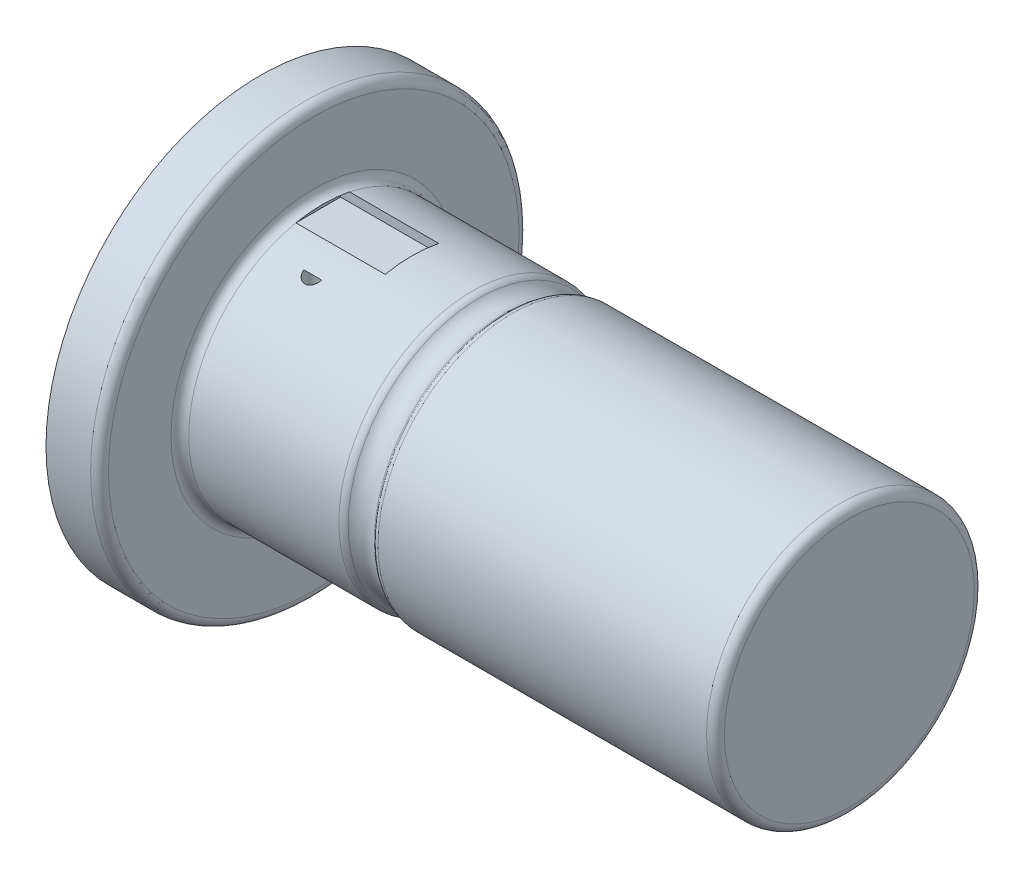
ISO-10303-21;
HEADER;
FILE_DESCRIPTION(('STEP AP214'),'2;1');
FILE_NAME('part.step','',(''),(''),'','','');
FILE_SCHEMA(('AUTOMOTIVE_DESIGN { 1 0 10303 214 1 1 1 1 }'));
ENDSEC;
DATA;
#1=APPLICATION_CONTEXT('core data for automotive mechanical design processes');
#2=APPLICATION_PROTOCOL_DEFINITION('international standard','automotive_design',2000,#1);
#3=PRODUCT_CONTEXT('',#1,'mechanical');
#4=PRODUCT('Part','Part','',(#3));
#5=PRODUCT_RELATED_PRODUCT_CATEGORY('part','',(#4));
#6=PRODUCT_DEFINITION_FORMATION('','',#4);
#7=PRODUCT_DEFINITION_CONTEXT('part definition',#1,'design');
#8=PRODUCT_DEFINITION('design','',#6,#7);
#9=PRODUCT_DEFINITION_SHAPE('','',#8);
#10=(LENGTH_UNIT() NAMED_UNIT(*) SI_UNIT(.MILLI.,.METRE.));
#11=(NAMED_UNIT(*) PLANE_ANGLE_UNIT() SI_UNIT($,.RADIAN.));
#12=(NAMED_UNIT(*) SI_UNIT($,.STERADIAN.) SOLID_ANGLE_UNIT());
#13=UNCERTAINTY_MEASURE_WITH_UNIT(LENGTH_MEASURE(1.E-05),#10,'distance_accuracy_value','');
#14=(GEOMETRIC_REPRESENTATION_CONTEXT(3) GLOBAL_UNCERTAINTY_ASSIGNED_CONTEXT((#13)) GLOBAL_UNIT_ASSIGNED_CONTEXT((#10,
#11,#12)) REPRESENTATION_CONTEXT('',''));
#15=CARTESIAN_POINT('',(0.,0.,0.));
#16=DIRECTION('',(0.,0.,1.));
#17=DIRECTION('',(1.,0.,0.));
#18=AXIS2_PLACEMENT_3D('',#15,#16,#17);
#19=CARTESIAN_POINT('',(13.7332121111929,0.,-7.34));
#20=CARTESIAN_POINT('',(13.7332121111929,-1.92160746857583,-7.33999999999999));
#21=CARTESIAN_POINT('',(13.7332121111923,-3.83138210210588,-6.54894544571172));
#22=CARTESIAN_POINT('',(13.7332121111935,-6.54894544571267,-3.83138210210675));
#23=CARTESIAN_POINT('',(13.7332121111929,-7.34,-1.92160746857666));
#24=CARTESIAN_POINT('',(13.7332121111929,-7.34,1.92160746857672));
#25=CARTESIAN_POINT('',(13.7332121111937,-6.54894544572052,3.8313821020992));
#26=CARTESIAN_POINT('',(13.7332121111922,-3.83138210209795,6.54894544571936));
#27=CARTESIAN_POINT('',(13.7332121111929,-1.92160746857146,7.34));
#28=CARTESIAN_POINT('',(13.7332121111929,1.92160746857152,7.34));
#29=CARTESIAN_POINT('',(13.7332121111926,3.83138210210221,6.54894544571586));
#30=CARTESIAN_POINT('',(13.7332121111932,6.54894544571635,3.83138210210262));
#31=CARTESIAN_POINT('',(13.7332121111929,7.34,1.92160746857346));
#32=CARTESIAN_POINT('',(13.7332121111929,7.34,-1.92160746857352));
#33=CARTESIAN_POINT('',(13.7332121111929,6.54894544571644,-3.83138210210209));
#34=CARTESIAN_POINT('',(13.7332121111929,3.83138210210204,-6.54894544571647));
#35=CARTESIAN_POINT('',(13.7332121111929,1.92160746857577,-7.34));
#36=CARTESIAN_POINT('',(13.7332121111929,0.,-7.34));
#37=CARTESIAN_POINT('',(13.8816002765534,0.,-7.5));
#38=CARTESIAN_POINT('',(13.8816002765534,-1.96349536979797,-7.5));
#39=CARTESIAN_POINT('',(13.8816002765551,-3.91489996809341,-6.69170174970395));
#40=CARTESIAN_POINT('',(13.8816002765517,-6.69170174970485,-3.91489996809422));
#41=CARTESIAN_POINT('',(13.8816002765534,-7.5,-1.96349536979904));
#42=CARTESIAN_POINT('',(13.8816002765534,-7.5,1.9634953697991));
#43=CARTESIAN_POINT('',(13.8816002765534,-6.69170174971599,3.91489996808138));
#44=CARTESIAN_POINT('',(13.8816002765534,-3.91489996808218,6.69170174971688));
#45=CARTESIAN_POINT('',(13.8816002765551,-1.96349536979339,7.49999999999915));
#46=CARTESIAN_POINT('',(13.8816002765517,1.96349536979345,7.50000000000085));
#47=CARTESIAN_POINT('',(13.8816002765534,3.91489996808819,6.69170174971003));
#48=CARTESIAN_POINT('',(13.8816002765534,6.69170174971007,3.91489996808814));
#49=CARTESIAN_POINT('',(13.8816002765534,7.5,1.96349536979577));
#50=CARTESIAN_POINT('',(13.8816002765534,7.5,-1.96349536979583));
#51=CARTESIAN_POINT('',(13.8816002765534,6.69170174971076,-3.9148999680883));
#52=CARTESIAN_POINT('',(13.8816002765534,3.91489996808741,-6.69170174970996));
#53=CARTESIAN_POINT('',(13.8816002765534,1.9634953697979,-7.5));
#54=CARTESIAN_POINT('',(13.8816002765534,0.,-7.5));
#55=CARTESIAN_POINT('',(14.0998181667894,0.,-7.5));
#56=CARTESIAN_POINT('',(14.0998181667894,-1.96349536979782,-7.49999999999999));
#57=CARTESIAN_POINT('',(14.0998181667894,-3.91489996809426,-6.69170174970396));
#58=CARTESIAN_POINT('',(14.0998181667894,-6.69170174970399,-3.91489996809421));
#59=CARTESIAN_POINT('',(14.0998181667894,-7.50000000000001,-1.96349536979904));
#60=CARTESIAN_POINT('',(14.0998181667894,-7.49999999999999,1.96349536979909));
#61=CARTESIAN_POINT('',(14.0998181667894,-6.6917017497177,3.91489996808053));
#62=CARTESIAN_POINT('',(14.0998181667894,-3.91489996808047,6.69170174971773));
#63=CARTESIAN_POINT('',(14.0998181667894,-1.96349536979316,7.50000000000001));
#64=CARTESIAN_POINT('',(14.0998181667894,1.96349536979323,7.49999999999999));
#65=CARTESIAN_POINT('',(14.0998181667894,3.91489996808819,6.69170174971003));
#66=CARTESIAN_POINT('',(14.0998181667894,6.69170174971006,3.91489996808814));
#67=CARTESIAN_POINT('',(14.0998181667894,7.50000000000001,1.96349536979577));
#68=CARTESIAN_POINT('',(14.0998181667894,7.49999999999999,-1.96349536979583));
#69=CARTESIAN_POINT('',(14.0998181667894,6.69170174971077,-3.91489996808745));
#70=CARTESIAN_POINT('',(14.0998181667894,3.9148999680874,-6.6917017497108));
#71=CARTESIAN_POINT('',(14.0998181667894,1.96349536979775,-7.50000000000001));
#72=CARTESIAN_POINT('',(14.0998181667894,0.,-7.5));
#73=(BOUNDED_SURFACE() B_SPLINE_SURFACE(2,3,((#19,#20,#21,#22,#23,#24,#25,#26,#27,#28,#29,#30,
#31,#32,#33,#34,#35,#36),(#37,#38,#39,#40,#41,#42,#43,#44,#45,#46,#47,#48,#49,#50,#51,#52,#53,
#54),(#55,#56,#57,#58,#59,#60,#61,#62,#63,#64,#65,#66,#67,#68,#69,#70,#71,#72)),.UNSPECIFIED.,
.F.,.T.,.F.) B_SPLINE_SURFACE_WITH_KNOTS((3,3),(4,2,2,2,2,2,2,2,4),(0.,1.),(-0.499999999999999,
-0.374999999999999,-0.249999999999999,-0.124999999999999,0.,0.125000000000001,0.250000000000001,
0.375000000000001,0.500000000000001),
.UNSPECIFIED.) GEOMETRIC_REPRESENTATION_ITEM() RATIONAL_B_SPLINE_SURFACE(((1.,1.,1.,1.,1.,1.,1.,
1.,1.,1.,1.,1.,1.,1.,1.,1.,1.,1.),(0.916515138991168,0.916515138991168,0.916515138991168,
0.916515138991168,0.916515138991168,0.916515138991168,0.916515138991168,0.916515138991168,
0.916515138991168,0.916515138991168,0.916515138991168,0.916515138991168,0.916515138991168,
0.916515138991168,0.916515138991167,0.916515138991167,0.916515138991168,0.916515138991168),(1.,
1.,1.,1.,1.,1.,1.,1.,1.,1.,1.,1.,1.,1.,1.,1.,1.,1.))) REPRESENTATION_ITEM('') SURFACE());
#74=CARTESIAN_POINT('',(13.7332121111929,0.,-7.34));
#75=CARTESIAN_POINT('',(13.7332121111929,1.92160746857577,-7.34));
#76=CARTESIAN_POINT('',(13.7332121111929,3.83138210210204,-6.54894544571647));
#77=CARTESIAN_POINT('',(13.7332121111929,6.54894544571644,-3.83138210210209));
#78=CARTESIAN_POINT('',(13.7332121111929,7.34,-1.92160746857352));
#79=CARTESIAN_POINT('',(13.7332121111929,7.34,1.92160746857346));
#80=CARTESIAN_POINT('',(13.7332121111932,6.54894544571635,3.83138210210262));
#81=CARTESIAN_POINT('',(13.7332121111926,3.83138210210221,6.54894544571586));
#82=CARTESIAN_POINT('',(13.7332121111929,1.92160746857152,7.34));
#83=CARTESIAN_POINT('',(13.7332121111929,-1.92160746857146,7.34));
#84=CARTESIAN_POINT('',(13.7332121111922,-3.83138210209795,6.54894544571936));
#85=CARTESIAN_POINT('',(13.7332121111937,-6.54894544572052,3.8313821020992));
#86=CARTESIAN_POINT('',(13.7332121111929,-7.34,1.92160746857672));
#87=CARTESIAN_POINT('',(13.7332121111929,-7.34,-1.92160746857666));
#88=CARTESIAN_POINT('',(13.7332121111935,-6.54894544571267,-3.83138210210675));
#89=CARTESIAN_POINT('',(13.7332121111923,-3.83138210210588,-6.54894544571172));
#90=CARTESIAN_POINT('',(13.7332121111929,-1.92160746857583,-7.33999999999999));
#91=CARTESIAN_POINT('',(13.7332121111929,0.,-7.34));
#92=(BOUNDED_CURVE() B_SPLINE_CURVE(3,(#74,#75,#76,#77,#78,#79,#80,#81,#82,#83,#84,#85,#86,#87,
#88,#89,#90,#91),.UNSPECIFIED.,.T.,.F.) B_SPLINE_CURVE_WITH_KNOTS((4,2,2,2,2,2,2,2,4),
(-0.499999999999999,-0.374999999999999,-0.249999999999999,-0.124999999999999,0.,
0.125000000000001,0.250000000000001,0.375000000000001,0.500000000000001),
.UNSPECIFIED.) CURVE() GEOMETRIC_REPRESENTATION_ITEM() RATIONAL_B_SPLINE_CURVE((1.,1.,1.,1.,1.,
1.,1.,1.,1.,1.,1.,1.,1.,1.,1.,1.,1.,1.)) REPRESENTATION_ITEM(''));
#93=CARTESIAN_POINT('',(13.7332121111929,0.,-7.34));
#94=VERTEX_POINT('',#93);
#95=EDGE_CURVE('E61',#94,#94,#92,.F.);
#96=CARTESIAN_POINT('',(14.0998181667894,0.,-7.5));
#97=CARTESIAN_POINT('',(14.0998181667894,-1.96349536979782,-7.49999999999999));
#98=CARTESIAN_POINT('',(14.0998181667894,-3.91489996809426,-6.69170174970396));
#99=CARTESIAN_POINT('',(14.0998181667894,-6.69170174970399,-3.91489996809421));
#100=CARTESIAN_POINT('',(14.0998181667894,-7.50000000000001,-1.96349536979904));
#101=CARTESIAN_POINT('',(14.0998181667894,-7.49999999999999,1.96349536979909));
#102=CARTESIAN_POINT('',(14.0998181667894,-6.6917017497177,3.91489996808053));
#103=CARTESIAN_POINT('',(14.0998181667894,-3.91489996808047,6.69170174971773));
#104=CARTESIAN_POINT('',(14.0998181667894,-1.96349536979316,7.50000000000001));
#105=CARTESIAN_POINT('',(14.0998181667894,1.96349536979323,7.49999999999999));
#106=CARTESIAN_POINT('',(14.0998181667894,3.91489996808819,6.69170174971003));
#107=CARTESIAN_POINT('',(14.0998181667894,6.69170174971006,3.91489996808814));
#108=CARTESIAN_POINT('',(14.0998181667894,7.50000000000001,1.96349536979577));
#109=CARTESIAN_POINT('',(14.0998181667894,7.49999999999999,-1.96349536979583));
#110=CARTESIAN_POINT('',(14.0998181667894,6.69170174971077,-3.91489996808745));
#111=CARTESIAN_POINT('',(14.0998181667894,3.9148999680874,-6.6917017497108));
#112=CARTESIAN_POINT('',(14.0998181667894,1.96349536979775,-7.50000000000001));
#113=CARTESIAN_POINT('',(14.0998181667894,0.,-7.5));
#114=(BOUNDED_CURVE() B_SPLINE_CURVE(3,(#96,#97,#98,#99,#100,#101,#102,#103,#104,#105,#106,#107,
#108,#109,#110,#111,#112,#113),.UNSPECIFIED.,.T.,.F.) B_SPLINE_CURVE_WITH_KNOTS((4,2,2,2,2,2,2,
2,4),(-0.499999999999999,-0.374999999999999,-0.249999999999999,-0.124999999999999,0.,
0.125000000000001,0.250000000000001,0.375000000000001,0.500000000000001),
.UNSPECIFIED.) CURVE() GEOMETRIC_REPRESENTATION_ITEM() RATIONAL_B_SPLINE_CURVE((1.,1.,1.,1.,1.,
1.,1.,1.,1.,1.,1.,1.,1.,1.,1.,1.,1.,1.)) REPRESENTATION_ITEM(''));
#115=CARTESIAN_POINT('',(14.0998181667894,0.,-7.5));
#116=VERTEX_POINT('',#115);
#117=EDGE_CURVE('E12',#116,#116,#114,.F.);
#118=ORIENTED_EDGE('',*,*,#95,.F.);
#119=EDGE_LOOP('',(#118));
#120=FACE_BOUND('',#119,.T.);
#121=ORIENTED_EDGE('',*,*,#117,.F.);
#122=EDGE_LOOP('',(#121));
#123=FACE_BOUND('',#122,.T.);
#124=ADVANCED_FACE('F48',(#120,#123),#73,.T.);
#125=CARTESIAN_POINT('',(11.9001818332106,0.,0.));
#126=DIRECTION('',(-1.,0.,0.));
#127=DIRECTION('',(0.,0.,1.));
#128=AXIS2_PLACEMENT_3D('',#125,#126,#127);
#129=TOROIDAL_SURFACE('',#128,7.,0.5);
#130=CARTESIAN_POINT('',(12.2667878888071,0.,0.));
#131=DIRECTION('',(1.,0.,0.));
#132=DIRECTION('',(0.,0.,-1.));
#133=AXIS2_PLACEMENT_3D('',#130,#131,#132);
#134=CIRCLE('',#133,7.34000000000002);
#135=CARTESIAN_POINT('',(12.2667878888071,0.,-7.34000000000002));
#136=VERTEX_POINT('',#135);
#137=EDGE_CURVE('E148',#136,#136,#134,.T.);
#138=ORIENTED_EDGE('',*,*,#137,.F.);
#139=EDGE_LOOP('',(#138));
#140=FACE_BOUND('',#139,.T.);
#141=CARTESIAN_POINT('',(11.9001818332106,0.,0.));
#142=DIRECTION('',(-1.,0.,0.));
#143=DIRECTION('',(0.,0.,1.));
#144=AXIS2_PLACEMENT_3D('',#141,#142,#143);
#145=CIRCLE('',#144,7.5);
#146=CARTESIAN_POINT('',(11.9001818332106,0.,7.5));
#147=VERTEX_POINT('',#146);
#148=EDGE_CURVE('E151',#147,#147,#145,.T.);
#149=ORIENTED_EDGE('',*,*,#148,.F.);
#150=EDGE_LOOP('',(#149));
#151=FACE_BOUND('',#150,.T.);
#152=ADVANCED_FACE('F236',(#140,#151),#129,.T.);
#153=CARTESIAN_POINT('',(33.,0.,0.));
#154=DIRECTION('',(-1.,0.,0.));
#155=DIRECTION('',(0.,0.,1.));
#156=AXIS2_PLACEMENT_3D('',#153,#154,#155);
#157=CYLINDRICAL_SURFACE('',#156,7.5);
#158=ORIENTED_EDGE('',*,*,#148,.T.);
#159=EDGE_LOOP('',(#158));
#160=FACE_BOUND('',#159,.T.);
#161=CARTESIAN_POINT('',(6.,-6.6332495807108,3.5));
#162=CARTESIAN_POINT('',(6.02581046020677,-6.63325053725622,3.49999846839941));
#163=CARTESIAN_POINT('',(6.05164287902081,-6.63431112340443,3.4979904336543));
#164=CARTESIAN_POINT('',(6.10254548667345,-6.63849100686603,3.49005103934906));
#165=CARTESIAN_POINT('',(6.12761457211608,-6.64161314891078,3.48411425850542));
#166=CARTESIAN_POINT('',(6.17619277650404,-6.64971850111664,3.46861923085948));
#167=CARTESIAN_POINT('',(6.19970656829205,-6.65469580760864,3.45907247066952));
#168=CARTESIAN_POINT('',(6.24470549105987,-6.66625131636745,3.43675001256464));
#169=CARTESIAN_POINT('',(6.26619068485855,-6.67282946903885,3.42397441468104));
#170=CARTESIAN_POINT('',(6.30775972750533,-6.68766176311949,3.3949165950777));
#171=CARTESIAN_POINT('',(6.32771786794,-6.6959838078913,3.37848977809819));
#172=CARTESIAN_POINT('',(6.36463360975647,-6.71373750142494,3.34307063646503));
#173=CARTESIAN_POINT('',(6.38159003689068,-6.72316958203291,3.32407731291411));
#174=CARTESIAN_POINT('',(6.41394637517371,-6.74389888572919,3.28183462201197));
#175=CARTESIAN_POINT('',(6.42897703930128,-6.75528741377898,3.25834704920194));
#176=CARTESIAN_POINT('',(6.45486217382584,-6.77865813001283,3.20944376515965));
#177=CARTESIAN_POINT('',(6.46571473980553,-6.79064058611288,3.18402718096928));
#178=CARTESIAN_POINT('',(6.48384088811419,-6.81591531939925,3.12958053647244));
#179=CARTESIAN_POINT('',(6.49071897684761,-6.82923057388007,3.10042877781246));
#180=CARTESIAN_POINT('',(6.49918423983507,-6.85576008605139,3.04131614019466));
#181=CARTESIAN_POINT('',(6.50077011148669,-6.86897431807827,3.01135506386414));
#182=CARTESIAN_POINT('',(6.49850525344405,-6.89530590415973,2.95057337948523));
#183=CARTESIAN_POINT('',(6.49449932162345,-6.90840992177046,2.91975245375204));
#184=CARTESIAN_POINT('',(6.48072911560121,-6.93375291528264,2.85904742101141));
#185=CARTESIAN_POINT('',(6.47096560145005,-6.94599200512323,2.82916319090036));
#186=CARTESIAN_POINT('',(6.44622578744554,-6.9688425944184,2.77238830870901));
#187=CARTESIAN_POINT('',(6.43144674654557,-6.97949643624613,2.7454290608923));
#188=CARTESIAN_POINT('',(6.39688585061558,-6.99937958260056,2.69433428415712));
#189=CARTESIAN_POINT('',(6.37710620669908,-7.00860951384002,2.67019751410621));
#190=CARTESIAN_POINT('',(6.33458993675361,-7.02479345982809,2.62731166124381));
#191=CARTESIAN_POINT('',(6.31215845250471,-7.0318617732696,2.60830327951922));
#192=CARTESIAN_POINT('',(6.26399864013113,-7.04436018919063,2.57435774208213));
#193=CARTESIAN_POINT('',(6.23827179283219,-7.04979102384412,2.55941876708508));
#194=CARTESIAN_POINT('',(6.18615372870463,-7.05856516952076,2.53511616939487));
#195=CARTESIAN_POINT('',(6.15992633634759,-7.06202521828376,2.52544276770339));
#196=CARTESIAN_POINT('',(6.10607404514197,-7.0673212382192,2.51058430869189));
#197=CARTESIAN_POINT('',(6.07844955711137,-7.06915768391261,2.50539793998248));
#198=CARTESIAN_POINT('',(6.02386615638336,-7.0711216406553,2.49984937188802));
#199=CARTESIAN_POINT('',(5.99692967122139,-7.07131921272316,2.49928940067872));
#200=CARTESIAN_POINT('',(5.9433500470587,-7.07018524500487,2.50249544816273));
#201=CARTESIAN_POINT('',(5.91670687534621,-7.06885387751405,2.50626097941763));
#202=CARTESIAN_POINT('',(5.864777650389,-7.06471436568139,2.51790549214181));
#203=CARTESIAN_POINT('',(5.83947963861141,-7.0619231291992,2.52573737071171));
#204=CARTESIAN_POINT('',(5.79060062092451,-7.05493222848629,2.54519891477317));
#205=CARTESIAN_POINT('',(5.76701969406707,-7.05073249946064,2.55682875498184));
#206=CARTESIAN_POINT('',(5.72172596030691,-7.04091524343145,2.58374163497954));
#207=CARTESIAN_POINT('',(5.70005869955032,-7.0352715983626,2.59909166329152));
#208=CARTESIAN_POINT('',(5.65962455931582,-7.02272744983348,2.63279736088945));
#209=CARTESIAN_POINT('',(5.64085819244333,-7.01582672470784,2.65115356020638));
#210=CARTESIAN_POINT('',(5.60580047546282,-7.00055984391923,2.69121561626974));
#211=CARTESIAN_POINT('',(5.58966550726509,-6.99214032738236,2.71303781934433));
#212=CARTESIAN_POINT('',(5.56126661447413,-6.97425940431029,2.75867841368377));
#213=CARTESIAN_POINT('',(5.54900374566106,-6.96479771455943,2.78249734714761));
#214=CARTESIAN_POINT('',(5.52783569685234,-6.94438081287179,2.83308414835651));
#215=CARTESIAN_POINT('',(5.51920323911089,-6.93336835890187,2.85994297577407));
#216=CARTESIAN_POINT('',(5.50658066021234,-6.91063756134362,2.91444011515551));
#217=CARTESIAN_POINT('',(5.50259208351752,-6.89891898427487,2.94207868331728));
#218=CARTESIAN_POINT('',(5.49912493457228,-6.87423716925231,2.99931623301412));
#219=CARTESIAN_POINT('',(5.49996864297422,-6.86124328827825,3.02892172552297));
#220=CARTESIAN_POINT('',(5.50682710922799,-6.83510082939237,3.08746264852342));
#221=CARTESIAN_POINT('',(5.51284346863132,-6.82195220481271,3.11639786863614));
#222=CARTESIAN_POINT('',(5.5302511225581,-6.79534713728128,3.17400435780609));
#223=CARTESIAN_POINT('',(5.54185038645721,-6.78189981840915,3.20261739427579));
#224=CARTESIAN_POINT('',(5.57028428645139,-6.7557168015545,3.25748602989674));
#225=CARTESIAN_POINT('',(5.58711933858784,-6.74298116021755,3.28374144149484));
#226=CARTESIAN_POINT('',(5.6253303857361,-6.71901075752431,3.33250930118534));
#227=CARTESIAN_POINT('',(5.64660569310222,-6.70775048251857,3.3550877126302));
#228=CARTESIAN_POINT('',(5.69347702022071,-6.68700340630464,3.39625054413835));
#229=CARTESIAN_POINT('',(5.71907147933598,-6.67751596711857,3.41483640133546));
#230=CARTESIAN_POINT('',(5.77139173763239,-6.66168110152889,3.44561722697866));
#231=CARTESIAN_POINT('',(5.79780296521047,-6.65512657957989,3.45823968625457));
#232=CARTESIAN_POINT('',(5.85282541833604,-6.64443166346298,3.47874456934257));
#233=CARTESIAN_POINT('',(5.88143084623722,-6.64028513966552,3.48663903003222));
#234=CARTESIAN_POINT('',(5.92530189465387,-6.63608827362723,3.49461589666869));
#235=CARTESIAN_POINT('',(5.94014689590899,-6.63502633627207,3.49663091841857));
#236=CARTESIAN_POINT('',(5.96999212580487,-6.63360671975203,3.49932340010726));
#237=CARTESIAN_POINT('',(5.98499235089675,-6.63324902452165,3.50000089055847));
#238=CARTESIAN_POINT('',(6.,-6.6332495807108,3.5));
#239=B_SPLINE_CURVE_WITH_KNOTS('',3,(#161,#162,#163,#164,#165,#166,#167,#168,#169,#170,#171,
#172,#173,#174,#175,#176,#177,#178,#179,#180,#181,#182,#183,#184,#185,#186,#187,#188,#189,#190,
#191,#192,#193,#194,#195,#196,#197,#198,#199,#200,#201,#202,#203,#204,#205,#206,#207,#208,#209,
#210,#211,#212,#213,#214,#215,#216,#217,#218,#219,#220,#221,#222,#223,#224,#225,#226,#227,#228,
#229,#230,#231,#232,#233,#234,#235,#236,#237,#238),.UNSPECIFIED.,.T.,.F.,(4,2,2,2,2,2,2,2,2,2,2,
2,2,2,2,2,2,2,2,2,2,2,2,2,2,2,2,2,2,2,2,2,2,2,2,2,2,2,4),(0.,0.0773721108397583,
0.154851210838869,0.232085826323507,0.309318049326463,0.390453696729441,0.471621013982055,
0.561606601903227,0.651633157695472,0.749524586330706,0.847440107743616,0.948127988502521,
1.04880258056817,1.14590491918395,1.24296439698378,1.3332088309533,1.42341285343893,
1.50748980026067,1.59154216627396,1.67198177530605,1.75241232053338,1.83193131698797,
1.91145397205949,1.9925316288286,2.07362359617045,2.15850008845585,2.24339970351781,
2.33386337053339,2.42435711537505,2.52095349472301,2.61757979292877,2.71812247785703,
2.81867315405753,2.91715248441261,3.0155963071701,3.10508732168977,3.19434952422925,
3.23933903509871,3.28432751963401),.UNSPECIFIED.);
#240=CARTESIAN_POINT('',(6.,-6.6332495807108,3.5));
#241=VERTEX_POINT('',#240);
#242=EDGE_CURVE('E143',#241,#241,#239,.T.);
#243=ORIENTED_EDGE('',*,*,#242,.T.);
#244=EDGE_LOOP('',(#243));
#245=FACE_BOUND('',#244,.T.);
#246=DIRECTION('',(-1.,0.,0.));
#247=VECTOR('',#246,1.);
#248=CARTESIAN_POINT('',(33.,6.84846922834953,3.0575266521078));
#249=LINE('',#248,#247);
#250=CARTESIAN_POINT('',(5.50332034036286,6.84846922834953,3.0575266521078));
#251=VERTEX_POINT('',#250);
#252=CARTESIAN_POINT('',(6.49667965963714,6.84846922834953,3.0575266521078));
#253=VERTEX_POINT('',#252);
#254=EDGE_CURVE('E134',#251,#253,#249,.F.);
#255=ORIENTED_EDGE('',*,*,#254,.T.);
#256=CARTESIAN_POINT('',(6.49667965963714,6.84846922834953,3.0575266521078));
#257=CARTESIAN_POINT('',(6.49319790975419,6.83502318788622,3.0876634787824));
#258=CARTESIAN_POINT('',(6.48696040762637,6.82147999795609,3.11744517069168));
#259=CARTESIAN_POINT('',(6.46914708738009,6.794611504604,3.17557096142006));
#260=CARTESIAN_POINT('',(6.4575573758415,6.78128686228145,3.20391110437284));
#261=CARTESIAN_POINT('',(6.42921572297062,6.75532668742682,3.25829390853775));
#262=CARTESIAN_POINT('',(6.41245749308836,6.74269201654868,3.28433372100822));
#263=CARTESIAN_POINT('',(6.37408700932944,6.71866932036597,3.33319988003086));
#264=CARTESIAN_POINT('',(6.35247937370277,6.7072801242022,3.35602925056633));
#265=CARTESIAN_POINT('',(6.30608445763364,6.68687476209494,3.39649739560704));
#266=CARTESIAN_POINT('',(6.28151999034378,6.67776620471821,3.414343853599));
#267=CARTESIAN_POINT('',(6.22902315975787,6.66174010836067,3.44550828212296));
#268=CARTESIAN_POINT('',(6.20109338339999,6.65482090106056,3.45882970137787));
#269=CARTESIAN_POINT('',(6.1460515249407,6.64430256138163,3.478988164914));
#270=CARTESIAN_POINT('',(6.1191987644345,6.64041819556818,3.48638471041787));
#271=CARTESIAN_POINT('',(6.06441129861515,6.63503745574211,3.4966144488506));
#272=CARTESIAN_POINT('',(6.0364774219722,6.63353928844844,3.49945106867951));
#273=CARTESIAN_POINT('',(5.98312119300806,6.63305948989809,3.50036014589193));
#274=CARTESIAN_POINT('',(5.95770677283871,6.63385685866327,3.49885098458424));
#275=CARTESIAN_POINT('',(5.90754272158415,6.63745064997678,3.49202857484656));
#276=CARTESIAN_POINT('',(5.8827930293029,6.64024688784662,3.4867156778493));
#277=CARTESIAN_POINT('',(5.83489267723412,6.64763621336476,3.47260632317404));
#278=CARTESIAN_POINT('',(5.8117277860656,6.65220983206384,3.46384759774542));
#279=CARTESIAN_POINT('',(5.7672356135016,6.66292246282814,3.44319605131114));
#280=CARTESIAN_POINT('',(5.74590874897638,6.66906182876624,3.43130252179133));
#281=CARTESIAN_POINT('',(5.70408718451563,6.68311172650462,3.40386114244076));
#282=CARTESIAN_POINT('',(5.68375315897483,6.69111565729944,3.38811685842738));
#283=CARTESIAN_POINT('',(5.64598200363001,6.70827951819017,3.35400513178917));
#284=CARTESIAN_POINT('',(5.62854622475008,6.71743998388667,3.33563647327328));
#285=CARTESIAN_POINT('',(5.59511368682763,6.7376283019787,3.29468347217933));
#286=CARTESIAN_POINT('',(5.5794693422165,6.74875110738242,3.27185842034959));
#287=CARTESIAN_POINT('',(5.55224235741386,6.77164850709554,3.22420148277242));
#288=CARTESIAN_POINT('',(5.54066028784538,6.78342319270503,3.19936931569019));
#289=CARTESIAN_POINT('',(5.52422335103637,6.80412575576511,3.1550440296851));
#290=CARTESIAN_POINT('',(5.51839981157616,6.81298501031867,3.13587102488243));
#291=CARTESIAN_POINT('',(5.50909894402987,6.8307309950273,3.09702665970978));
#292=CARTESIAN_POINT('',(5.50561678132765,6.8396176302664,3.07735641381474));
#293=CARTESIAN_POINT('',(5.50332034036286,6.84846922834953,3.0575266521078));
#294=B_SPLINE_CURVE_WITH_KNOTS('',3,(#256,#257,#258,#259,#260,#261,#262,#263,#264,#265,#266,
#267,#268,#269,#270,#271,#272,#273,#274,#275,#276,#277,#278,#279,#280,#281,#282,#283,#284,#285,
#286,#287,#288,#289,#290,#291,#292,#293),.UNSPECIFIED.,.F.,.F.,(4,2,2,2,2,2,2,2,2,2,2,2,2,2,2,2,
2,2,4),(0.,0.0994489086693399,0.19915743345689,0.298987755681097,0.398723406587445,
0.493290374977345,0.587785107326142,0.671686839579734,0.755525488020934,0.831570147569043,
0.907607782145605,0.982834987488655,1.05807920994392,1.13854943405235,1.21905706221166,
1.30816057276007,1.39727659456628,1.46287837383179,1.52834427515067),.UNSPECIFIED.);
#295=EDGE_CURVE('E138',#253,#251,#294,.T.);
#296=ORIENTED_EDGE('',*,*,#295,.T.);
#297=EDGE_LOOP('',(#255,#296));
#298=FACE_BOUND('',#297,.T.);
#299=DIRECTION('',(-1.,0.,0.));
#300=VECTOR('',#299,1.);
#301=CARTESIAN_POINT('',(8.5,7.34846922834953,-1.5));
#302=LINE('',#301,#300);
#303=CARTESIAN_POINT('',(8.5,7.34846922834953,-1.5));
#304=VERTEX_POINT('',#303);
#305=CARTESIAN_POINT('',(3.5,7.34846922834953,-1.5));
#306=VERTEX_POINT('',#305);
#307=EDGE_CURVE('E324',#304,#306,#302,.T.);
#308=ORIENTED_EDGE('',*,*,#307,.F.);
#309=CARTESIAN_POINT('',(8.5,0.,0.));
#310=DIRECTION('',(1.,0.,0.));
#311=DIRECTION('',(0.,0.,-1.));
#312=AXIS2_PLACEMENT_3D('',#309,#310,#311);
#313=CIRCLE('',#312,7.5);
#314=CARTESIAN_POINT('',(8.5,7.34846922834953,1.5));
#315=VERTEX_POINT('',#314);
#316=EDGE_CURVE('E296',#304,#315,#313,.T.);
#317=ORIENTED_EDGE('',*,*,#316,.T.);
#318=DIRECTION('',(-1.,0.,0.));
#319=VECTOR('',#318,1.);
#320=CARTESIAN_POINT('',(8.5,7.34846922834953,1.5));
#321=LINE('',#320,#319);
#322=CARTESIAN_POINT('',(3.5,7.34846922834953,1.5));
#323=VERTEX_POINT('',#322);
#324=EDGE_CURVE('E320',#315,#323,#321,.T.);
#325=ORIENTED_EDGE('',*,*,#324,.T.);
#326=CARTESIAN_POINT('',(3.5,0.,0.));
#327=DIRECTION('',(-1.,0.,0.));
#328=DIRECTION('',(0.,0.,1.));
#329=AXIS2_PLACEMENT_3D('',#326,#327,#328);
#330=CIRCLE('',#329,7.5);
#331=CARTESIAN_POINT('',(3.5,-7.34846922834953,1.5));
#332=VERTEX_POINT('',#331);
#333=EDGE_CURVE('E370',#323,#332,#330,.F.);
#334=ORIENTED_EDGE('',*,*,#333,.T.);
#335=DIRECTION('',(-1.,0.,0.));
#336=VECTOR('',#335,1.);
#337=CARTESIAN_POINT('',(8.5,-7.34846922834953,1.5));
#338=LINE('',#337,#336);
#339=CARTESIAN_POINT('',(8.5,-7.34846922834953,1.5));
#340=VERTEX_POINT('',#339);
#341=EDGE_CURVE('E308',#340,#332,#338,.T.);
#342=ORIENTED_EDGE('',*,*,#341,.F.);
#343=CARTESIAN_POINT('',(8.5,0.,0.));
#344=DIRECTION('',(1.,0.,0.));
#345=DIRECTION('',(0.,0.,-1.));
#346=AXIS2_PLACEMENT_3D('',#343,#344,#345);
#347=CIRCLE('',#346,7.5);
#348=CARTESIAN_POINT('',(8.5,-7.34846922834953,-1.5));
#349=VERTEX_POINT('',#348);
#350=EDGE_CURVE('E331',#340,#349,#347,.T.);
#351=ORIENTED_EDGE('',*,*,#350,.T.);
#352=DIRECTION('',(-1.,0.,0.));
#353=VECTOR('',#352,1.);
#354=CARTESIAN_POINT('',(8.5,-7.34846922834953,-1.5));
#355=LINE('',#354,#353);
#356=CARTESIAN_POINT('',(3.5,-7.34846922834953,-1.5));
#357=VERTEX_POINT('',#356);
#358=EDGE_CURVE('E356',#349,#357,#355,.T.);
#359=ORIENTED_EDGE('',*,*,#358,.T.);
#360=EDGE_CURVE('E374',#357,#306,#330,.F.);
#361=ORIENTED_EDGE('',*,*,#360,.T.);
#362=EDGE_LOOP('',(#308,#317,#325,#334,#342,#351,#359,#361));
#363=FACE_BOUND('',#362,.T.);
#364=ADVANCED_FACE('F146',(#160,#245,#298,#363),#157,.T.);
#365=CARTESIAN_POINT('',(3.5,0.,0.));
#366=DIRECTION('',(-1.,0.,0.));
#367=DIRECTION('',(0.,0.,1.));
#368=AXIS2_PLACEMENT_3D('',#365,#366,#367);
#369=TOROIDAL_SURFACE('',#368,8.,0.5);
#370=EDGE_CURVE('E371',#332,#357,#330,.F.);
#371=ORIENTED_EDGE('',*,*,#370,.F.);
#372=ORIENTED_EDGE('',*,*,#333,.F.);
#373=EDGE_CURVE('E665',#306,#323,#330,.F.);
#374=ORIENTED_EDGE('',*,*,#373,.F.);
#375=ORIENTED_EDGE('',*,*,#360,.F.);
#376=EDGE_LOOP('',(#371,#372,#374,#375));
#377=FACE_BOUND('',#376,.T.);
#378=CARTESIAN_POINT('',(3.,0.,0.));
#379=DIRECTION('',(-1.,0.,0.));
#380=DIRECTION('',(0.,0.,1.));
#381=AXIS2_PLACEMENT_3D('',#378,#379,#380);
#382=CIRCLE('',#381,8.);
#383=CARTESIAN_POINT('',(3.,0.,8.));
#384=VERTEX_POINT('',#383);
#385=EDGE_CURVE('E373',#384,#384,#382,.T.);
#386=ORIENTED_EDGE('',*,*,#385,.F.);
#387=EDGE_LOOP('',(#386));
#388=FACE_BOUND('',#387,.T.);
#389=ADVANCED_FACE('F387',(#377,#388),#369,.F.);
#390=CARTESIAN_POINT('',(3.,0.,0.));
#391=DIRECTION('',(-1.,0.,0.));
#392=DIRECTION('',(0.,0.,1.));
#393=AXIS2_PLACEMENT_3D('',#390,#391,#392);
#394=PLANE('',#393);
#395=ORIENTED_EDGE('',*,*,#385,.T.);
#396=EDGE_LOOP('',(#395));
#397=FACE_BOUND('',#396,.T.);
#398=CARTESIAN_POINT('',(3.,0.,0.));
#399=DIRECTION('',(1.,0.,0.));
#400=DIRECTION('',(0.,0.,-1.));
#401=AXIS2_PLACEMENT_3D('',#398,#399,#400);
#402=CIRCLE('',#401,11.5);
#403=CARTESIAN_POINT('',(3.,0.,-11.5));
#404=VERTEX_POINT('',#403);
#405=EDGE_CURVE('E367',#404,#404,#402,.T.);
#406=ORIENTED_EDGE('',*,*,#405,.T.);
#407=EDGE_LOOP('',(#406));
#408=FACE_BOUND('',#407,.T.);
#409=ADVANCED_FACE('F392',(#397,#408),#394,.F.);
#410=CARTESIAN_POINT('',(2.5,0.,0.));
#411=DIRECTION('',(1.,0.,0.));
#412=DIRECTION('',(0.,0.,-1.));
#413=AXIS2_PLACEMENT_3D('',#410,#411,#412);
#414=TOROIDAL_SURFACE('',#413,11.5,0.499999999999999);
#415=CARTESIAN_POINT('',(2.5,0.,0.));
#416=DIRECTION('',(1.,0.,0.));
#417=DIRECTION('',(0.,0.,-1.));
#418=AXIS2_PLACEMENT_3D('',#415,#416,#417);
#419=CIRCLE('',#418,12.);
#420=CARTESIAN_POINT('',(2.5,0.,-12.));
#421=VERTEX_POINT('',#420);
#422=EDGE_CURVE('E364',#421,#421,#419,.T.);
#423=ORIENTED_EDGE('',*,*,#422,.T.);
#424=EDGE_LOOP('',(#423));
#425=FACE_BOUND('',#424,.T.);
#426=ORIENTED_EDGE('',*,*,#405,.F.);
#427=EDGE_LOOP('',(#426));
#428=FACE_BOUND('',#427,.T.);
#429=ADVANCED_FACE('F406',(#425,#428),#414,.T.);
#430=CARTESIAN_POINT('',(3.,0.,0.));
#431=DIRECTION('',(1.,0.,0.));
#432=DIRECTION('',(0.,0.,-1.));
#433=AXIS2_PLACEMENT_3D('',#430,#431,#432);
#434=CYLINDRICAL_SURFACE('',#433,12.);
#435=ORIENTED_EDGE('',*,*,#422,.F.);
#436=EDGE_LOOP('',(#435));
#437=FACE_BOUND('',#436,.T.);
#438=CARTESIAN_POINT('',(0.,0.,0.));
#439=DIRECTION('',(1.,0.,0.));
#440=DIRECTION('',(0.,0.,-1.));
#441=AXIS2_PLACEMENT_3D('',#438,#439,#440);
#442=CIRCLE('',#441,12.);
#443=CARTESIAN_POINT('',(0.,0.,-12.));
#444=VERTEX_POINT('',#443);
#445=EDGE_CURVE('E327',#444,#444,#442,.T.);
#446=ORIENTED_EDGE('',*,*,#445,.T.);
#447=EDGE_LOOP('',(#446));
#448=FACE_BOUND('',#447,.T.);
#449=ADVANCED_FACE('F414',(#437,#448),#434,.T.);
#450=CARTESIAN_POINT('',(0.,0.,0.));
#451=DIRECTION('',(1.,0.,0.));
#452=DIRECTION('',(0.,0.,-1.));
#453=AXIS2_PLACEMENT_3D('',#450,#451,#452);
#454=PLANE('',#453);
#455=CARTESIAN_POINT('',(0.,0.,0.));
#456=DIRECTION('',(-1.,0.,0.));
#457=DIRECTION('',(0.,0.,1.));
#458=AXIS2_PLACEMENT_3D('',#455,#456,#457);
#459=CIRCLE('',#458,5.);
#460=CARTESIAN_POINT('',(0.,0.,5.));
#461=VERTEX_POINT('',#460);
#462=EDGE_CURVE('E288',#461,#461,#459,.T.);
#463=ORIENTED_EDGE('',*,*,#462,.F.);
#464=EDGE_LOOP('',(#463));
#465=FACE_BOUND('',#464,.T.);
#466=ORIENTED_EDGE('',*,*,#445,.F.);
#467=EDGE_LOOP('',(#466));
#468=FACE_BOUND('',#467,.T.);
#469=ADVANCED_FACE('F219',(#465,#468),#454,.F.);
#470=CARTESIAN_POINT('',(8.5,0.,1.5));
#471=DIRECTION('',(0.,0.,1.));
#472=DIRECTION('',(1.,0.,0.));
#473=AXIS2_PLACEMENT_3D('',#470,#471,#472);
#474=PLANE('',#473);
#475=DIRECTION('',(0.,1.,0.));
#476=VECTOR('',#475,1.);
#477=CARTESIAN_POINT('',(3.,0.,1.5));
#478=LINE('',#477,#476);
#479=CARTESIAN_POINT('',(3.,-7.34846922834953,1.5));
#480=VERTEX_POINT('',#479);
#481=CARTESIAN_POINT('',(3.,-6.84846922834953,1.5));
#482=VERTEX_POINT('',#481);
#483=EDGE_CURVE('E341',#480,#482,#478,.T.);
#484=ORIENTED_EDGE('',*,*,#483,.T.);
#485=DIRECTION('',(-1.,0.,0.));
#486=VECTOR('',#485,1.);
#487=CARTESIAN_POINT('',(8.5,-6.84846922834953,1.5));
#488=LINE('',#487,#486);
#489=CARTESIAN_POINT('',(8.5,-6.84846922834953,1.5));
#490=VERTEX_POINT('',#489);
#491=EDGE_CURVE('E340',#490,#482,#488,.T.);
#492=ORIENTED_EDGE('',*,*,#491,.F.);
#493=DIRECTION('',(0.,1.,0.));
#494=VECTOR('',#493,1.);
#495=CARTESIAN_POINT('',(8.5,0.,1.5));
#496=LINE('',#495,#494);
#497=EDGE_CURVE('E328',#340,#490,#496,.T.);
#498=ORIENTED_EDGE('',*,*,#497,.F.);
#499=ORIENTED_EDGE('',*,*,#341,.T.);
#500=EDGE_CURVE('E359',#332,#480,#338,.T.);
#501=ORIENTED_EDGE('',*,*,#500,.T.);
#502=EDGE_LOOP('',(#484,#492,#498,#499,#501));
#503=FACE_BOUND('',#502,.T.);
#504=ADVANCED_FACE('F216',(#503),#474,.F.);
#505=CARTESIAN_POINT('',(8.5,0.,0.));
#506=DIRECTION('',(-1.,0.,0.));
#507=DIRECTION('',(0.,0.,1.));
#508=AXIS2_PLACEMENT_3D('',#505,#506,#507);
#509=CYLINDRICAL_SURFACE('',#508,7.5);
#510=CARTESIAN_POINT('',(3.,-7.34846922834953,-1.5));
#511=VERTEX_POINT('',#510);
#512=EDGE_CURVE('E355',#357,#511,#355,.T.);
#513=ORIENTED_EDGE('',*,*,#512,.T.);
#514=CARTESIAN_POINT('',(3.,0.,0.));
#515=DIRECTION('',(1.,0.,0.));
#516=DIRECTION('',(0.,0.,-1.));
#517=AXIS2_PLACEMENT_3D('',#514,#515,#516);
#518=CIRCLE('',#517,7.5);
#519=EDGE_CURVE('E344',#480,#511,#518,.T.);
#520=ORIENTED_EDGE('',*,*,#519,.F.);
#521=ORIENTED_EDGE('',*,*,#500,.F.);
#522=ORIENTED_EDGE('',*,*,#370,.T.);
#523=EDGE_LOOP('',(#513,#520,#521,#522));
#524=FACE_BOUND('',#523,.T.);
#525=ADVANCED_FACE('F212',(#524),#509,.F.);
#526=CARTESIAN_POINT('',(8.5,0.,-1.5));
#527=DIRECTION('',(0.,0.,-1.));
#528=DIRECTION('',(-1.,0.,0.));
#529=AXIS2_PLACEMENT_3D('',#526,#527,#528);
#530=PLANE('',#529);
#531=DIRECTION('',(0.,-1.,0.));
#532=VECTOR('',#531,1.);
#533=CARTESIAN_POINT('',(3.,0.,-1.5));
#534=LINE('',#533,#532);
#535=CARTESIAN_POINT('',(3.,-6.84846922834953,-1.5));
#536=VERTEX_POINT('',#535);
#537=EDGE_CURVE('E347',#536,#511,#534,.T.);
#538=ORIENTED_EDGE('',*,*,#537,.T.);
#539=ORIENTED_EDGE('',*,*,#512,.F.);
#540=ORIENTED_EDGE('',*,*,#358,.F.);
#541=DIRECTION('',(0.,-1.,0.));
#542=VECTOR('',#541,1.);
#543=CARTESIAN_POINT('',(8.5,0.,-1.5));
#544=LINE('',#543,#542);
#545=CARTESIAN_POINT('',(8.5,-6.84846922834953,-1.5));
#546=VERTEX_POINT('',#545);
#547=EDGE_CURVE('E335',#546,#349,#544,.T.);
#548=ORIENTED_EDGE('',*,*,#547,.F.);
#549=DIRECTION('',(-1.,0.,0.));
#550=VECTOR('',#549,1.);
#551=CARTESIAN_POINT('',(8.5,-6.84846922834953,-1.5));
#552=LINE('',#551,#550);
#553=EDGE_CURVE('E353',#546,#536,#552,.T.);
#554=ORIENTED_EDGE('',*,*,#553,.T.);
#555=EDGE_LOOP('',(#538,#539,#540,#548,#554));
#556=FACE_BOUND('',#555,.T.);
#557=ADVANCED_FACE('F208',(#556),#530,.F.);
#558=CARTESIAN_POINT('',(8.5,-6.84846922834953,0.));
#559=DIRECTION('',(0.,1.,0.));
#560=DIRECTION('',(0.,0.,1.));
#561=AXIS2_PLACEMENT_3D('',#558,#559,#560);
#562=PLANE('',#561);
#563=DIRECTION('',(0.,0.,-1.));
#564=VECTOR('',#563,1.);
#565=CARTESIAN_POINT('',(3.,-6.84846922834953,0.));
#566=LINE('',#565,#564);
#567=EDGE_CURVE('E332',#482,#536,#566,.T.);
#568=ORIENTED_EDGE('',*,*,#567,.T.);
#569=ORIENTED_EDGE('',*,*,#553,.F.);
#570=DIRECTION('',(0.,0.,-1.));
#571=VECTOR('',#570,1.);
#572=CARTESIAN_POINT('',(8.5,-6.84846922834953,0.));
#573=LINE('',#572,#571);
#574=EDGE_CURVE('E337',#490,#546,#573,.T.);
#575=ORIENTED_EDGE('',*,*,#574,.F.);
#576=ORIENTED_EDGE('',*,*,#491,.T.);
#577=EDGE_LOOP('',(#568,#569,#575,#576));
#578=FACE_BOUND('',#577,.T.);
#579=ADVANCED_FACE('F201',(#578),#562,.F.);
#580=CARTESIAN_POINT('',(8.5,0.,0.));
#581=DIRECTION('',(1.,0.,0.));
#582=DIRECTION('',(0.,0.,-1.));
#583=AXIS2_PLACEMENT_3D('',#580,#581,#582);
#584=PLANE('',#583);
#585=ORIENTED_EDGE('',*,*,#497,.T.);
#586=ORIENTED_EDGE('',*,*,#574,.T.);
#587=ORIENTED_EDGE('',*,*,#547,.T.);
#588=ORIENTED_EDGE('',*,*,#350,.F.);
#589=EDGE_LOOP('',(#585,#586,#587,#588));
#590=FACE_BOUND('',#589,.T.);
#591=ADVANCED_FACE('F198',(#590),#584,.F.);
#592=CARTESIAN_POINT('',(3.,0.,0.));
#593=DIRECTION('',(1.,0.,0.));
#594=DIRECTION('',(0.,0.,-1.));
#595=AXIS2_PLACEMENT_3D('',#592,#593,#594);
#596=PLANE('',#595);
#597=ORIENTED_EDGE('',*,*,#483,.F.);
#598=ORIENTED_EDGE('',*,*,#519,.T.);
#599=ORIENTED_EDGE('',*,*,#537,.F.);
#600=ORIENTED_EDGE('',*,*,#567,.F.);
#601=EDGE_LOOP('',(#597,#598,#599,#600));
#602=FACE_BOUND('',#601,.T.);
#603=ADVANCED_FACE('F196',(#602),#596,.T.);
#604=CARTESIAN_POINT('',(8.5,0.,-1.5));
#605=DIRECTION('',(0.,0.,1.));
#606=DIRECTION('',(1.,0.,0.));
#607=AXIS2_PLACEMENT_3D('',#604,#605,#606);
#608=PLANE('',#607);
#609=DIRECTION('',(0.,1.,0.));
#610=VECTOR('',#609,1.);
#611=CARTESIAN_POINT('',(3.,0.,-1.5));
#612=LINE('',#611,#610);
#613=CARTESIAN_POINT('',(3.,6.84846922834953,-1.5));
#614=VERTEX_POINT('',#613);
#615=CARTESIAN_POINT('',(3.,7.34846922834953,-1.5));
#616=VERTEX_POINT('',#615);
#617=EDGE_CURVE('E304',#614,#616,#612,.T.);
#618=ORIENTED_EDGE('',*,*,#617,.F.);
#619=DIRECTION('',(-1.,0.,0.));
#620=VECTOR('',#619,1.);
#621=CARTESIAN_POINT('',(8.5,6.84846922834953,-1.5));
#622=LINE('',#621,#620);
#623=CARTESIAN_POINT('',(8.5,6.84846922834953,-1.5));
#624=VERTEX_POINT('',#623);
#625=EDGE_CURVE('E303',#624,#614,#622,.T.);
#626=ORIENTED_EDGE('',*,*,#625,.F.);
#627=DIRECTION('',(0.,1.,0.));
#628=VECTOR('',#627,1.);
#629=CARTESIAN_POINT('',(8.5,0.,-1.5));
#630=LINE('',#629,#628);
#631=EDGE_CURVE('E293',#624,#304,#630,.T.);
#632=ORIENTED_EDGE('',*,*,#631,.T.);
#633=ORIENTED_EDGE('',*,*,#307,.T.);
#634=EDGE_CURVE('E323',#306,#616,#302,.T.);
#635=ORIENTED_EDGE('',*,*,#634,.T.);
#636=EDGE_LOOP('',(#618,#626,#632,#633,#635));
#637=FACE_BOUND('',#636,.T.);
#638=ADVANCED_FACE('F192',(#637),#608,.T.);
#639=CARTESIAN_POINT('',(8.5,0.,0.));
#640=DIRECTION('',(-1.,0.,0.));
#641=DIRECTION('',(0.,0.,1.));
#642=AXIS2_PLACEMENT_3D('',#639,#640,#641);
#643=CYLINDRICAL_SURFACE('',#642,7.5);
#644=CARTESIAN_POINT('',(3.,7.34846922834953,1.5));
#645=VERTEX_POINT('',#644);
#646=EDGE_CURVE('E319',#323,#645,#321,.T.);
#647=ORIENTED_EDGE('',*,*,#646,.T.);
#648=CARTESIAN_POINT('',(3.,0.,0.));
#649=DIRECTION('',(1.,0.,0.));
#650=DIRECTION('',(0.,0.,-1.));
#651=AXIS2_PLACEMENT_3D('',#648,#649,#650);
#652=CIRCLE('',#651,7.5);
#653=EDGE_CURVE('E307',#616,#645,#652,.T.);
#654=ORIENTED_EDGE('',*,*,#653,.F.);
#655=ORIENTED_EDGE('',*,*,#634,.F.);
#656=ORIENTED_EDGE('',*,*,#373,.T.);
#657=EDGE_LOOP('',(#647,#654,#655,#656));
#658=FACE_BOUND('',#657,.T.);
#659=ADVANCED_FACE('F188',(#658),#643,.F.);
#660=CARTESIAN_POINT('',(8.5,0.,1.5));
#661=DIRECTION('',(0.,0.,-1.));
#662=DIRECTION('',(-1.,0.,0.));
#663=AXIS2_PLACEMENT_3D('',#660,#661,#662);
#664=PLANE('',#663);
#665=DIRECTION('',(0.,-1.,0.));
#666=VECTOR('',#665,1.);
#667=CARTESIAN_POINT('',(3.,0.,1.5));
#668=LINE('',#667,#666);
#669=CARTESIAN_POINT('',(3.,6.84846922834953,1.5));
#670=VERTEX_POINT('',#669);
#671=EDGE_CURVE('E311',#645,#670,#668,.T.);
#672=ORIENTED_EDGE('',*,*,#671,.F.);
#673=ORIENTED_EDGE('',*,*,#646,.F.);
#674=ORIENTED_EDGE('',*,*,#324,.F.);
#675=DIRECTION('',(0.,-1.,0.));
#676=VECTOR('',#675,1.);
#677=CARTESIAN_POINT('',(8.5,0.,1.5));
#678=LINE('',#677,#676);
#679=CARTESIAN_POINT('',(8.5,6.84846922834953,1.5));
#680=VERTEX_POINT('',#679);
#681=EDGE_CURVE('E75',#315,#680,#678,.T.);
#682=ORIENTED_EDGE('',*,*,#681,.T.);
#683=DIRECTION('',(-1.,0.,0.));
#684=VECTOR('',#683,1.);
#685=CARTESIAN_POINT('',(8.5,6.84846922834953,1.5));
#686=LINE('',#685,#684);
#687=EDGE_CURVE('E316',#680,#670,#686,.T.);
#688=ORIENTED_EDGE('',*,*,#687,.T.);
#689=EDGE_LOOP('',(#672,#673,#674,#682,#688));
#690=FACE_BOUND('',#689,.T.);
#691=ADVANCED_FACE('F184',(#690),#664,.T.);
#692=CARTESIAN_POINT('',(8.5,6.84846922834953,0.));
#693=DIRECTION('',(0.,1.,0.));
#694=DIRECTION('',(0.,0.,1.));
#695=AXIS2_PLACEMENT_3D('',#692,#693,#694);
#696=PLANE('',#695);
#697=DIRECTION('',(0.,0.,-1.));
#698=VECTOR('',#697,1.);
#699=CARTESIAN_POINT('',(3.,6.84846922834953,0.));
#700=LINE('',#699,#698);
#701=EDGE_CURVE('E297',#670,#614,#700,.T.);
#702=ORIENTED_EDGE('',*,*,#701,.F.);
#703=ORIENTED_EDGE('',*,*,#687,.F.);
#704=DIRECTION('',(0.,0.,-1.));
#705=VECTOR('',#704,1.);
#706=CARTESIAN_POINT('',(8.5,6.84846922834953,0.));
#707=LINE('',#706,#705);
#708=EDGE_CURVE('E301',#680,#624,#707,.T.);
#709=ORIENTED_EDGE('',*,*,#708,.T.);
#710=ORIENTED_EDGE('',*,*,#625,.T.);
#711=EDGE_LOOP('',(#702,#703,#709,#710));
#712=FACE_BOUND('',#711,.T.);
#713=ADVANCED_FACE('F178',(#712),#696,.T.);
#714=CARTESIAN_POINT('',(8.5,0.,0.));
#715=DIRECTION('',(1.,0.,0.));
#716=DIRECTION('',(0.,0.,-1.));
#717=AXIS2_PLACEMENT_3D('',#714,#715,#716);
#718=PLANE('',#717);
#719=ORIENTED_EDGE('',*,*,#631,.F.);
#720=ORIENTED_EDGE('',*,*,#708,.F.);
#721=ORIENTED_EDGE('',*,*,#681,.F.);
#722=ORIENTED_EDGE('',*,*,#316,.F.);
#723=EDGE_LOOP('',(#719,#720,#721,#722));
#724=FACE_BOUND('',#723,.T.);
#725=ADVANCED_FACE('F174',(#724),#718,.F.);
#726=CARTESIAN_POINT('',(3.,0.,0.));
#727=DIRECTION('',(1.,0.,0.));
#728=DIRECTION('',(0.,0.,-1.));
#729=AXIS2_PLACEMENT_3D('',#726,#727,#728);
#730=PLANE('',#729);
#731=ORIENTED_EDGE('',*,*,#617,.T.);
#732=ORIENTED_EDGE('',*,*,#653,.T.);
#733=ORIENTED_EDGE('',*,*,#671,.T.);
#734=ORIENTED_EDGE('',*,*,#701,.T.);
#735=EDGE_LOOP('',(#731,#732,#733,#734));
#736=FACE_BOUND('',#735,.T.);
#737=ADVANCED_FACE('F171',(#736),#730,.T.);
#738=CARTESIAN_POINT('',(6.,-12.,3.));
#739=DIRECTION('',(0.,1.,0.));
#740=DIRECTION('',(0.,0.,1.));
#741=AXIS2_PLACEMENT_3D('',#738,#739,#740);
#742=CYLINDRICAL_SURFACE('',#741,0.500000000000001);
#743=ORIENTED_EDGE('',*,*,#242,.F.);
#744=EDGE_LOOP('',(#743));
#745=FACE_BOUND('',#744,.T.);
#746=CARTESIAN_POINT('',(6.,6.84846922834953,3.));
#747=DIRECTION('',(0.,1.,0.));
#748=DIRECTION('',(0.,0.,1.));
#749=AXIS2_PLACEMENT_3D('',#746,#747,#748);
#750=CIRCLE('',#749,0.500000000000001);
#751=EDGE_CURVE('E67',#253,#251,#750,.T.);
#752=ORIENTED_EDGE('',*,*,#751,.T.);
#753=ORIENTED_EDGE('',*,*,#295,.F.);
#754=EDGE_LOOP('',(#752,#753));
#755=FACE_BOUND('',#754,.T.);
#756=ADVANCED_FACE('F142',(#745,#755),#742,.F.);
#757=CARTESIAN_POINT('',(6.,6.84846922834953,3.));
#758=DIRECTION('',(0.,1.,0.));
#759=DIRECTION('',(0.,0.,1.));
#760=AXIS2_PLACEMENT_3D('',#757,#758,#759);
#761=PLANE('',#760);
#762=ORIENTED_EDGE('',*,*,#751,.F.);
#763=ORIENTED_EDGE('',*,*,#254,.F.);
#764=EDGE_LOOP('',(#762,#763));
#765=FACE_BOUND('',#764,.T.);
#766=ADVANCED_FACE('F135',(#765),#761,.F.);
#767=CARTESIAN_POINT('',(13.,0.,0.));
#768=DIRECTION('',(1.,0.,0.));
#769=DIRECTION('',(0.,0.,-1.));
#770=AXIS2_PLACEMENT_3D('',#767,#768,#769);
#771=TOROIDAL_SURFACE('',#770,8.02,1.);
#772=ORIENTED_EDGE('',*,*,#95,.T.);
#773=EDGE_LOOP('',(#772));
#774=FACE_BOUND('',#773,.T.);
#775=ORIENTED_EDGE('',*,*,#137,.T.);
#776=EDGE_LOOP('',(#775));
#777=FACE_BOUND('',#776,.T.);
#778=ADVANCED_FACE('F224',(#774,#777),#771,.F.);
#779=CARTESIAN_POINT('',(33.,0.,0.));
#780=DIRECTION('',(1.,0.,0.));
#781=DIRECTION('',(0.,0.,-1.));
#782=AXIS2_PLACEMENT_3D('',#779,#780,#781);
#783=PLANE('',#782);
#784=CARTESIAN_POINT('',(33.,0.,0.));
#785=DIRECTION('',(1.,0.,0.));
#786=DIRECTION('',(0.,0.,-1.));
#787=AXIS2_PLACEMENT_3D('',#784,#785,#786);
#788=CIRCLE('',#787,7.);
#789=CARTESIAN_POINT('',(33.,0.,-7.));
#790=VERTEX_POINT('',#789);
#791=EDGE_CURVE('E139',#790,#790,#788,.T.);
#792=ORIENTED_EDGE('',*,*,#791,.T.);
#793=EDGE_LOOP('',(#792));
#794=FACE_BOUND('',#793,.T.);
#795=ADVANCED_FACE('F221',(#794),#783,.T.);
#796=CARTESIAN_POINT('',(32.5,0.,0.));
#797=DIRECTION('',(1.,0.,0.));
#798=DIRECTION('',(0.,0.,-1.));
#799=AXIS2_PLACEMENT_3D('',#796,#797,#798);
#800=TOROIDAL_SURFACE('',#799,7.,0.5);
#801=CARTESIAN_POINT('',(32.5,0.,0.));
#802=DIRECTION('',(1.,0.,0.));
#803=DIRECTION('',(0.,0.,-1.));
#804=AXIS2_PLACEMENT_3D('',#801,#802,#803);
#805=CIRCLE('',#804,7.5);
#806=CARTESIAN_POINT('',(32.5,0.,-7.5));
#807=VERTEX_POINT('',#806);
#808=EDGE_CURVE('E377',#807,#807,#805,.F.);
#809=ORIENTED_EDGE('',*,*,#808,.F.);
#810=EDGE_LOOP('',(#809));
#811=FACE_BOUND('',#810,.T.);
#812=ORIENTED_EDGE('',*,*,#791,.F.);
#813=EDGE_LOOP('',(#812));
#814=FACE_BOUND('',#813,.T.);
#815=ADVANCED_FACE('F223',(#811,#814),#800,.T.);
#816=ORIENTED_EDGE('',*,*,#117,.T.);
#817=EDGE_LOOP('',(#816));
#818=FACE_BOUND('',#817,.T.);
#819=ORIENTED_EDGE('',*,*,#808,.T.);
#820=EDGE_LOOP('',(#819));
#821=FACE_BOUND('',#820,.T.);
#822=ADVANCED_FACE('F230',(#818,#821),#157,.T.);
#823=CARTESIAN_POINT('',(5.,0.,0.));
#824=DIRECTION('',(-1.,0.,0.));
#825=DIRECTION('',(0.,0.,1.));
#826=AXIS2_PLACEMENT_3D('',#823,#824,#825);
#827=CYLINDRICAL_SURFACE('',#826,5.);
#828=CARTESIAN_POINT('',(5.,0.,0.));
#829=DIRECTION('',(-1.,0.,0.));
#830=DIRECTION('',(0.,0.,1.));
#831=AXIS2_PLACEMENT_3D('',#828,#829,#830);
#832=CIRCLE('',#831,5.);
#833=CARTESIAN_POINT('',(5.,0.,5.));
#834=VERTEX_POINT('',#833);
#835=EDGE_CURVE('E144',#834,#834,#832,.T.);
#836=ORIENTED_EDGE('',*,*,#835,.F.);
#837=EDGE_LOOP('',(#836));
#838=FACE_BOUND('',#837,.T.);
#839=ORIENTED_EDGE('',*,*,#462,.T.);
#840=EDGE_LOOP('',(#839));
#841=FACE_BOUND('',#840,.T.);
#842=ADVANCED_FACE('F277',(#838,#841),#827,.F.);
#843=CARTESIAN_POINT('',(5.,0.,0.));
#844=DIRECTION('',(-1.,0.,0.));
#845=DIRECTION('',(0.,0.,1.));
#846=AXIS2_PLACEMENT_3D('',#843,#844,#845);
#847=PLANE('',#846);
#848=ORIENTED_EDGE('',*,*,#835,.T.);
#849=EDGE_LOOP('',(#848));
#850=FACE_BOUND('',#849,.T.);
#851=ADVANCED_FACE('F280',(#850),#847,.T.);
#852=CLOSED_SHELL('',(#124,#152,#364,#389,#409,#429,#449,#469,#504,#525,#557,#579,#591,#603,
#638,#659,#691,#713,#725,#737,#756,#766,#778,#795,#815,#822,#842,#851));
#853=MANIFOLD_SOLID_BREP('B2',#852);
#854=ADVANCED_BREP_SHAPE_REPRESENTATION('',(#18,#853),#14);
#855=SHAPE_DEFINITION_REPRESENTATION(#9,#854);
ENDSEC;
END-ISO-10303-21;
